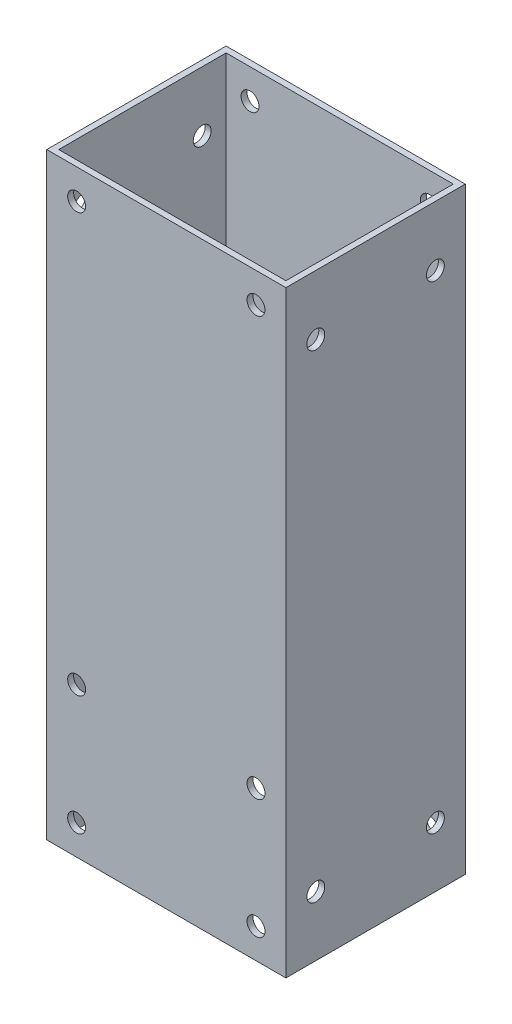
ISO-10303-21;
HEADER;
FILE_DESCRIPTION(('STEP AP214'),'2;1');
FILE_NAME('part.step','',(''),(''),'','','');
FILE_SCHEMA(('AUTOMOTIVE_DESIGN { 1 0 10303 214 1 1 1 1 }'));
ENDSEC;
DATA;
#1=APPLICATION_CONTEXT('core data for automotive mechanical design processes');
#2=APPLICATION_PROTOCOL_DEFINITION('international standard','automotive_design',2000,#1);
#3=PRODUCT_CONTEXT('',#1,'mechanical');
#4=PRODUCT('Part','Part','',(#3));
#5=PRODUCT_RELATED_PRODUCT_CATEGORY('part','',(#4));
#6=PRODUCT_DEFINITION_FORMATION('','',#4);
#7=PRODUCT_DEFINITION_CONTEXT('part definition',#1,'design');
#8=PRODUCT_DEFINITION('design','',#6,#7);
#9=PRODUCT_DEFINITION_SHAPE('','',#8);
#10=(LENGTH_UNIT() NAMED_UNIT(*) SI_UNIT(.MILLI.,.METRE.));
#11=(NAMED_UNIT(*) PLANE_ANGLE_UNIT() SI_UNIT($,.RADIAN.));
#12=(NAMED_UNIT(*) SI_UNIT($,.STERADIAN.) SOLID_ANGLE_UNIT());
#13=UNCERTAINTY_MEASURE_WITH_UNIT(LENGTH_MEASURE(1.E-05),#10,'distance_accuracy_value','');
#14=(GEOMETRIC_REPRESENTATION_CONTEXT(3) GLOBAL_UNCERTAINTY_ASSIGNED_CONTEXT((#13)) GLOBAL_UNIT_ASSIGNED_CONTEXT((#10,
#11,#12)) REPRESENTATION_CONTEXT('',''));
#15=CARTESIAN_POINT('',(0.,0.,0.));
#16=DIRECTION('',(0.,0.,1.));
#17=DIRECTION('',(1.,0.,0.));
#18=AXIS2_PLACEMENT_3D('',#15,#16,#17);
#19=CARTESIAN_POINT('',(0.,100.,0.));
#20=DIRECTION('',(0.,1.,0.));
#21=DIRECTION('',(0.,0.,1.));
#22=AXIS2_PLACEMENT_3D('',#19,#20,#21);
#23=PLANE('',#22);
#24=DIRECTION('',(0.,0.,1.));
#25=VECTOR('',#24,1.);
#26=CARTESIAN_POINT('',(0.,100.,0.));
#27=LINE('',#26,#25);
#28=CARTESIAN_POINT('',(0.,100.,-30.));
#29=VERTEX_POINT('',#28);
#30=CARTESIAN_POINT('',(0.,100.,0.));
#31=VERTEX_POINT('',#30);
#32=EDGE_CURVE('E165',#29,#31,#27,.T.);
#33=ORIENTED_EDGE('',*,*,#32,.T.);
#34=DIRECTION('',(1.,0.,0.));
#35=VECTOR('',#34,1.);
#36=CARTESIAN_POINT('',(0.,100.,0.));
#37=LINE('',#36,#35);
#38=CARTESIAN_POINT('',(40.,100.,0.));
#39=VERTEX_POINT('',#38);
#40=EDGE_CURVE('E168',#31,#39,#37,.T.);
#41=ORIENTED_EDGE('',*,*,#40,.T.);
#42=DIRECTION('',(0.,0.,-1.));
#43=VECTOR('',#42,1.);
#44=CARTESIAN_POINT('',(40.,100.,0.));
#45=LINE('',#44,#43);
#46=CARTESIAN_POINT('',(40.,100.,-30.));
#47=VERTEX_POINT('',#46);
#48=EDGE_CURVE('E171',#39,#47,#45,.T.);
#49=ORIENTED_EDGE('',*,*,#48,.T.);
#50=DIRECTION('',(-1.,0.,0.));
#51=VECTOR('',#50,1.);
#52=CARTESIAN_POINT('',(0.,100.,-30.));
#53=LINE('',#52,#51);
#54=EDGE_CURVE('E173',#47,#29,#53,.T.);
#55=ORIENTED_EDGE('',*,*,#54,.T.);
#56=EDGE_LOOP('',(#33,#41,#49,#55));
#57=FACE_BOUND('',#56,.T.);
#58=DIRECTION('',(1.,0.,0.));
#59=VECTOR('',#58,1.);
#60=CARTESIAN_POINT('',(0.,100.,-1.));
#61=LINE('',#60,#59);
#62=CARTESIAN_POINT('',(1.,100.,-1.));
#63=VERTEX_POINT('',#62);
#64=CARTESIAN_POINT('',(39.,100.,-1.));
#65=VERTEX_POINT('',#64);
#66=EDGE_CURVE('E135',#63,#65,#61,.T.);
#67=ORIENTED_EDGE('',*,*,#66,.F.);
#68=DIRECTION('',(0.,0.,1.));
#69=VECTOR('',#68,1.);
#70=CARTESIAN_POINT('',(1.,100.,0.));
#71=LINE('',#70,#69);
#72=CARTESIAN_POINT('',(1.,100.,-29.));
#73=VERTEX_POINT('',#72);
#74=EDGE_CURVE('E127',#73,#63,#71,.T.);
#75=ORIENTED_EDGE('',*,*,#74,.F.);
#76=DIRECTION('',(-1.,0.,0.));
#77=VECTOR('',#76,1.);
#78=CARTESIAN_POINT('',(0.,100.,-29.));
#79=LINE('',#78,#77);
#80=CARTESIAN_POINT('',(39.,100.,-29.));
#81=VERTEX_POINT('',#80);
#82=EDGE_CURVE('E149',#81,#73,#79,.T.);
#83=ORIENTED_EDGE('',*,*,#82,.F.);
#84=DIRECTION('',(0.,0.,-1.));
#85=VECTOR('',#84,1.);
#86=CARTESIAN_POINT('',(39.,100.,0.));
#87=LINE('',#86,#85);
#88=EDGE_CURVE('E147',#65,#81,#87,.T.);
#89=ORIENTED_EDGE('',*,*,#88,.F.);
#90=EDGE_LOOP('',(#67,#75,#83,#89));
#91=FACE_BOUND('',#90,.T.);
#92=ADVANCED_FACE('F60',(#57,#91),#23,.T.);
#93=CARTESIAN_POINT('',(0.,0.,0.));
#94=DIRECTION('',(0.,1.,0.));
#95=DIRECTION('',(0.,0.,1.));
#96=AXIS2_PLACEMENT_3D('',#93,#94,#95);
#97=PLANE('',#96);
#98=DIRECTION('',(0.,0.,1.));
#99=VECTOR('',#98,1.);
#100=CARTESIAN_POINT('',(0.,0.,0.));
#101=LINE('',#100,#99);
#102=CARTESIAN_POINT('',(0.,0.,-30.));
#103=VERTEX_POINT('',#102);
#104=CARTESIAN_POINT('',(0.,0.,0.));
#105=VERTEX_POINT('',#104);
#106=EDGE_CURVE('E143',#103,#105,#101,.T.);
#107=ORIENTED_EDGE('',*,*,#106,.F.);
#108=DIRECTION('',(-1.,0.,0.));
#109=VECTOR('',#108,1.);
#110=CARTESIAN_POINT('',(0.,0.,-30.));
#111=LINE('',#110,#109);
#112=CARTESIAN_POINT('',(40.,0.,-30.));
#113=VERTEX_POINT('',#112);
#114=EDGE_CURVE('E169',#113,#103,#111,.T.);
#115=ORIENTED_EDGE('',*,*,#114,.F.);
#116=DIRECTION('',(0.,0.,-1.));
#117=VECTOR('',#116,1.);
#118=CARTESIAN_POINT('',(40.,0.,0.));
#119=LINE('',#118,#117);
#120=CARTESIAN_POINT('',(40.,0.,0.));
#121=VERTEX_POINT('',#120);
#122=EDGE_CURVE('E180',#121,#113,#119,.T.);
#123=ORIENTED_EDGE('',*,*,#122,.F.);
#124=DIRECTION('',(1.,0.,0.));
#125=VECTOR('',#124,1.);
#126=CARTESIAN_POINT('',(0.,0.,0.));
#127=LINE('',#126,#125);
#128=EDGE_CURVE('E178',#105,#121,#127,.T.);
#129=ORIENTED_EDGE('',*,*,#128,.F.);
#130=EDGE_LOOP('',(#107,#115,#123,#129));
#131=FACE_BOUND('',#130,.T.);
#132=DIRECTION('',(0.,0.,1.));
#133=VECTOR('',#132,1.);
#134=CARTESIAN_POINT('',(1.,0.,0.));
#135=LINE('',#134,#133);
#136=CARTESIAN_POINT('',(1.,0.,-29.));
#137=VERTEX_POINT('',#136);
#138=CARTESIAN_POINT('',(1.,0.,-1.));
#139=VERTEX_POINT('',#138);
#140=EDGE_CURVE('E85',#137,#139,#135,.T.);
#141=ORIENTED_EDGE('',*,*,#140,.T.);
#142=DIRECTION('',(1.,0.,0.));
#143=VECTOR('',#142,1.);
#144=CARTESIAN_POINT('',(0.,0.,-1.));
#145=LINE('',#144,#143);
#146=CARTESIAN_POINT('',(39.,0.,-1.));
#147=VERTEX_POINT('',#146);
#148=EDGE_CURVE('E142',#139,#147,#145,.T.);
#149=ORIENTED_EDGE('',*,*,#148,.T.);
#150=DIRECTION('',(0.,0.,-1.));
#151=VECTOR('',#150,1.);
#152=CARTESIAN_POINT('',(39.,0.,0.));
#153=LINE('',#152,#151);
#154=CARTESIAN_POINT('',(39.,0.,-29.));
#155=VERTEX_POINT('',#154);
#156=EDGE_CURVE('E157',#147,#155,#153,.T.);
#157=ORIENTED_EDGE('',*,*,#156,.T.);
#158=DIRECTION('',(-1.,0.,0.));
#159=VECTOR('',#158,1.);
#160=CARTESIAN_POINT('',(0.,0.,-29.));
#161=LINE('',#160,#159);
#162=EDGE_CURVE('E136',#155,#137,#161,.T.);
#163=ORIENTED_EDGE('',*,*,#162,.T.);
#164=EDGE_LOOP('',(#141,#149,#157,#163));
#165=FACE_BOUND('',#164,.T.);
#166=ADVANCED_FACE('F326',(#131,#165),#97,.F.);
#167=CARTESIAN_POINT('',(0.,100.,0.));
#168=DIRECTION('',(1.,0.,0.));
#169=DIRECTION('',(0.,0.,-1.));
#170=AXIS2_PLACEMENT_3D('',#167,#168,#169);
#171=PLANE('',#170);
#172=CARTESIAN_POINT('',(0.,90.,-5.));
#173=DIRECTION('',(-1.,0.,0.));
#174=DIRECTION('',(0.,0.,1.));
#175=AXIS2_PLACEMENT_3D('',#172,#173,#174);
#176=CIRCLE('',#175,1.5);
#177=CARTESIAN_POINT('',(0.,90.,-3.5));
#178=VERTEX_POINT('',#177);
#179=EDGE_CURVE('E373',#178,#178,#176,.T.);
#180=ORIENTED_EDGE('',*,*,#179,.F.);
#181=EDGE_LOOP('',(#180));
#182=FACE_BOUND('',#181,.T.);
#183=CARTESIAN_POINT('',(0.,10.,-25.));
#184=DIRECTION('',(-1.,0.,0.));
#185=DIRECTION('',(0.,0.,1.));
#186=AXIS2_PLACEMENT_3D('',#183,#184,#185);
#187=CIRCLE('',#186,1.5);
#188=CARTESIAN_POINT('',(0.,10.,-23.5));
#189=VERTEX_POINT('',#188);
#190=EDGE_CURVE('E369',#189,#189,#187,.T.);
#191=ORIENTED_EDGE('',*,*,#190,.F.);
#192=EDGE_LOOP('',(#191));
#193=FACE_BOUND('',#192,.T.);
#194=CARTESIAN_POINT('',(0.,10.,-4.99999999999999));
#195=DIRECTION('',(-1.,0.,0.));
#196=DIRECTION('',(0.,0.,1.));
#197=AXIS2_PLACEMENT_3D('',#194,#195,#196);
#198=CIRCLE('',#197,1.5);
#199=CARTESIAN_POINT('',(0.,10.,-3.49999999999999));
#200=VERTEX_POINT('',#199);
#201=EDGE_CURVE('E377',#200,#200,#198,.T.);
#202=ORIENTED_EDGE('',*,*,#201,.F.);
#203=EDGE_LOOP('',(#202));
#204=FACE_BOUND('',#203,.T.);
#205=CARTESIAN_POINT('',(0.,90.,-25.));
#206=DIRECTION('',(-1.,0.,0.));
#207=DIRECTION('',(0.,0.,1.));
#208=AXIS2_PLACEMENT_3D('',#205,#206,#207);
#209=CIRCLE('',#208,1.5);
#210=CARTESIAN_POINT('',(0.,90.,-23.5));
#211=VERTEX_POINT('',#210);
#212=EDGE_CURVE('E365',#211,#211,#209,.T.);
#213=ORIENTED_EDGE('',*,*,#212,.F.);
#214=EDGE_LOOP('',(#213));
#215=FACE_BOUND('',#214,.T.);
#216=ORIENTED_EDGE('',*,*,#106,.T.);
#217=DIRECTION('',(0.,-1.,0.));
#218=VECTOR('',#217,1.);
#219=CARTESIAN_POINT('',(0.,100.,0.));
#220=LINE('',#219,#218);
#221=EDGE_CURVE('E12',#31,#105,#220,.T.);
#222=ORIENTED_EDGE('',*,*,#221,.F.);
#223=ORIENTED_EDGE('',*,*,#32,.F.);
#224=DIRECTION('',(0.,-1.,0.));
#225=VECTOR('',#224,1.);
#226=CARTESIAN_POINT('',(0.,100.,-30.));
#227=LINE('',#226,#225);
#228=EDGE_CURVE('E175',#29,#103,#227,.T.);
#229=ORIENTED_EDGE('',*,*,#228,.T.);
#230=EDGE_LOOP('',(#216,#222,#223,#229));
#231=FACE_BOUND('',#230,.T.);
#232=ADVANCED_FACE('F62',(#182,#193,#204,#215,#231),#171,.F.);
#233=CARTESIAN_POINT('',(0.,100.,0.));
#234=DIRECTION('',(0.,0.,-1.));
#235=DIRECTION('',(-1.,0.,0.));
#236=AXIS2_PLACEMENT_3D('',#233,#234,#235);
#237=PLANE('',#236);
#238=CARTESIAN_POINT('',(35.,95.,0.));
#239=DIRECTION('',(0.,0.,1.));
#240=DIRECTION('',(1.,0.,0.));
#241=AXIS2_PLACEMENT_3D('',#238,#239,#240);
#242=CIRCLE('',#241,1.5);
#243=CARTESIAN_POINT('',(36.5,95.,0.));
#244=VERTEX_POINT('',#243);
#245=EDGE_CURVE('E250',#244,#244,#242,.T.);
#246=ORIENTED_EDGE('',*,*,#245,.F.);
#247=EDGE_LOOP('',(#246));
#248=FACE_BOUND('',#247,.T.);
#249=CARTESIAN_POINT('',(35.,25.,0.));
#250=DIRECTION('',(0.,0.,1.));
#251=DIRECTION('',(1.,0.,0.));
#252=AXIS2_PLACEMENT_3D('',#249,#250,#251);
#253=CIRCLE('',#252,1.5);
#254=CARTESIAN_POINT('',(36.5,25.,0.));
#255=VERTEX_POINT('',#254);
#256=EDGE_CURVE('E256',#255,#255,#253,.T.);
#257=ORIENTED_EDGE('',*,*,#256,.F.);
#258=EDGE_LOOP('',(#257));
#259=FACE_BOUND('',#258,.T.);
#260=CARTESIAN_POINT('',(5.00000000000001,25.,0.));
#261=DIRECTION('',(0.,0.,1.));
#262=DIRECTION('',(1.,0.,0.));
#263=AXIS2_PLACEMENT_3D('',#260,#261,#262);
#264=CIRCLE('',#263,1.5);
#265=CARTESIAN_POINT('',(6.50000000000001,25.,0.));
#266=VERTEX_POINT('',#265);
#267=EDGE_CURVE('E262',#266,#266,#264,.T.);
#268=ORIENTED_EDGE('',*,*,#267,.F.);
#269=EDGE_LOOP('',(#268));
#270=FACE_BOUND('',#269,.T.);
#271=CARTESIAN_POINT('',(5.00000000000001,5.,0.));
#272=DIRECTION('',(0.,0.,1.));
#273=DIRECTION('',(1.,0.,0.));
#274=AXIS2_PLACEMENT_3D('',#271,#272,#273);
#275=CIRCLE('',#274,1.5);
#276=CARTESIAN_POINT('',(6.50000000000001,5.,0.));
#277=VERTEX_POINT('',#276);
#278=EDGE_CURVE('E243',#277,#277,#275,.T.);
#279=ORIENTED_EDGE('',*,*,#278,.F.);
#280=EDGE_LOOP('',(#279));
#281=FACE_BOUND('',#280,.T.);
#282=CARTESIAN_POINT('',(35.,5.,0.));
#283=DIRECTION('',(0.,0.,1.));
#284=DIRECTION('',(1.,0.,0.));
#285=AXIS2_PLACEMENT_3D('',#282,#283,#284);
#286=CIRCLE('',#285,1.5);
#287=CARTESIAN_POINT('',(36.5,5.,0.));
#288=VERTEX_POINT('',#287);
#289=EDGE_CURVE('E239',#288,#288,#286,.T.);
#290=ORIENTED_EDGE('',*,*,#289,.F.);
#291=EDGE_LOOP('',(#290));
#292=FACE_BOUND('',#291,.T.);
#293=CARTESIAN_POINT('',(5.,95.,0.));
#294=DIRECTION('',(0.,0.,1.));
#295=DIRECTION('',(1.,0.,0.));
#296=AXIS2_PLACEMENT_3D('',#293,#294,#295);
#297=CIRCLE('',#296,1.5);
#298=CARTESIAN_POINT('',(6.5,95.,0.));
#299=VERTEX_POINT('',#298);
#300=EDGE_CURVE('E249',#299,#299,#297,.T.);
#301=ORIENTED_EDGE('',*,*,#300,.F.);
#302=EDGE_LOOP('',(#301));
#303=FACE_BOUND('',#302,.T.);
#304=ORIENTED_EDGE('',*,*,#128,.T.);
#305=DIRECTION('',(0.,-1.,0.));
#306=VECTOR('',#305,1.);
#307=CARTESIAN_POINT('',(40.,100.,0.));
#308=LINE('',#307,#306);
#309=EDGE_CURVE('E69',#39,#121,#308,.T.);
#310=ORIENTED_EDGE('',*,*,#309,.F.);
#311=ORIENTED_EDGE('',*,*,#40,.F.);
#312=ORIENTED_EDGE('',*,*,#221,.T.);
#313=EDGE_LOOP('',(#304,#310,#311,#312));
#314=FACE_BOUND('',#313,.T.);
#315=ADVANCED_FACE('F312',(#248,#259,#270,#281,#292,#303,#314),#237,.F.);
#316=CARTESIAN_POINT('',(40.,100.,0.));
#317=DIRECTION('',(-1.,0.,0.));
#318=DIRECTION('',(0.,0.,1.));
#319=AXIS2_PLACEMENT_3D('',#316,#317,#318);
#320=PLANE('',#319);
#321=CARTESIAN_POINT('',(40.,90.,-5.));
#322=DIRECTION('',(-1.,0.,0.));
#323=DIRECTION('',(0.,0.,1.));
#324=AXIS2_PLACEMENT_3D('',#321,#322,#323);
#325=CIRCLE('',#324,1.5);
#326=CARTESIAN_POINT('',(40.,90.,-3.5));
#327=VERTEX_POINT('',#326);
#328=EDGE_CURVE('E353',#327,#327,#325,.T.);
#329=ORIENTED_EDGE('',*,*,#328,.T.);
#330=EDGE_LOOP('',(#329));
#331=FACE_BOUND('',#330,.T.);
#332=CARTESIAN_POINT('',(40.,10.,-25.));
#333=DIRECTION('',(-1.,0.,0.));
#334=DIRECTION('',(0.,0.,1.));
#335=AXIS2_PLACEMENT_3D('',#332,#333,#334);
#336=CIRCLE('',#335,1.5);
#337=CARTESIAN_POINT('',(40.,10.,-23.5));
#338=VERTEX_POINT('',#337);
#339=EDGE_CURVE('E357',#338,#338,#336,.T.);
#340=ORIENTED_EDGE('',*,*,#339,.T.);
#341=EDGE_LOOP('',(#340));
#342=FACE_BOUND('',#341,.T.);
#343=CARTESIAN_POINT('',(40.,10.,-4.99999999999999));
#344=DIRECTION('',(-1.,0.,0.));
#345=DIRECTION('',(0.,0.,1.));
#346=AXIS2_PLACEMENT_3D('',#343,#344,#345);
#347=CIRCLE('',#346,1.5);
#348=CARTESIAN_POINT('',(40.,10.,-3.49999999999999));
#349=VERTEX_POINT('',#348);
#350=EDGE_CURVE('E361',#349,#349,#347,.T.);
#351=ORIENTED_EDGE('',*,*,#350,.T.);
#352=EDGE_LOOP('',(#351));
#353=FACE_BOUND('',#352,.T.);
#354=CARTESIAN_POINT('',(40.,90.,-25.));
#355=DIRECTION('',(-1.,0.,0.));
#356=DIRECTION('',(0.,0.,1.));
#357=AXIS2_PLACEMENT_3D('',#354,#355,#356);
#358=CIRCLE('',#357,1.5);
#359=CARTESIAN_POINT('',(40.,90.,-23.5));
#360=VERTEX_POINT('',#359);
#361=EDGE_CURVE('E218',#360,#360,#358,.T.);
#362=ORIENTED_EDGE('',*,*,#361,.T.);
#363=EDGE_LOOP('',(#362));
#364=FACE_BOUND('',#363,.T.);
#365=ORIENTED_EDGE('',*,*,#122,.T.);
#366=DIRECTION('',(0.,-1.,0.));
#367=VECTOR('',#366,1.);
#368=CARTESIAN_POINT('',(40.,100.,-30.));
#369=LINE('',#368,#367);
#370=EDGE_CURVE('E185',#47,#113,#369,.T.);
#371=ORIENTED_EDGE('',*,*,#370,.F.);
#372=ORIENTED_EDGE('',*,*,#48,.F.);
#373=ORIENTED_EDGE('',*,*,#309,.T.);
#374=EDGE_LOOP('',(#365,#371,#372,#373));
#375=FACE_BOUND('',#374,.T.);
#376=ADVANCED_FACE('F315',(#331,#342,#353,#364,#375),#320,.F.);
#377=CARTESIAN_POINT('',(0.,100.,-30.));
#378=DIRECTION('',(0.,0.,1.));
#379=DIRECTION('',(1.,0.,0.));
#380=AXIS2_PLACEMENT_3D('',#377,#378,#379);
#381=PLANE('',#380);
#382=CARTESIAN_POINT('',(35.,95.,-30.));
#383=DIRECTION('',(0.,0.,1.));
#384=DIRECTION('',(1.,0.,0.));
#385=AXIS2_PLACEMENT_3D('',#382,#383,#384);
#386=CIRCLE('',#385,1.5);
#387=CARTESIAN_POINT('',(36.5,95.,-30.));
#388=VERTEX_POINT('',#387);
#389=EDGE_CURVE('E246',#388,#388,#386,.T.);
#390=ORIENTED_EDGE('',*,*,#389,.T.);
#391=EDGE_LOOP('',(#390));
#392=FACE_BOUND('',#391,.T.);
#393=CARTESIAN_POINT('',(35.,25.,-30.));
#394=DIRECTION('',(0.,0.,1.));
#395=DIRECTION('',(1.,0.,0.));
#396=AXIS2_PLACEMENT_3D('',#393,#394,#395);
#397=CIRCLE('',#396,1.5);
#398=CARTESIAN_POINT('',(36.5,25.,-30.));
#399=VERTEX_POINT('',#398);
#400=EDGE_CURVE('E253',#399,#399,#397,.T.);
#401=ORIENTED_EDGE('',*,*,#400,.T.);
#402=EDGE_LOOP('',(#401));
#403=FACE_BOUND('',#402,.T.);
#404=CARTESIAN_POINT('',(5.00000000000001,25.,-30.));
#405=DIRECTION('',(0.,0.,1.));
#406=DIRECTION('',(1.,0.,0.));
#407=AXIS2_PLACEMENT_3D('',#404,#405,#406);
#408=CIRCLE('',#407,1.5);
#409=CARTESIAN_POINT('',(6.50000000000001,25.,-30.));
#410=VERTEX_POINT('',#409);
#411=EDGE_CURVE('E259',#410,#410,#408,.T.);
#412=ORIENTED_EDGE('',*,*,#411,.T.);
#413=EDGE_LOOP('',(#412));
#414=FACE_BOUND('',#413,.T.);
#415=CARTESIAN_POINT('',(5.00000000000001,5.,-30.));
#416=DIRECTION('',(0.,0.,1.));
#417=DIRECTION('',(1.,0.,0.));
#418=AXIS2_PLACEMENT_3D('',#415,#416,#417);
#419=CIRCLE('',#418,1.5);
#420=CARTESIAN_POINT('',(6.50000000000001,5.,-30.));
#421=VERTEX_POINT('',#420);
#422=EDGE_CURVE('E265',#421,#421,#419,.T.);
#423=ORIENTED_EDGE('',*,*,#422,.T.);
#424=EDGE_LOOP('',(#423));
#425=FACE_BOUND('',#424,.T.);
#426=CARTESIAN_POINT('',(35.,5.,-30.));
#427=DIRECTION('',(0.,0.,1.));
#428=DIRECTION('',(1.,0.,0.));
#429=AXIS2_PLACEMENT_3D('',#426,#427,#428);
#430=CIRCLE('',#429,1.5);
#431=CARTESIAN_POINT('',(36.5,5.,-30.));
#432=VERTEX_POINT('',#431);
#433=EDGE_CURVE('E240',#432,#432,#430,.T.);
#434=ORIENTED_EDGE('',*,*,#433,.T.);
#435=EDGE_LOOP('',(#434));
#436=FACE_BOUND('',#435,.T.);
#437=CARTESIAN_POINT('',(5.,95.,-30.));
#438=DIRECTION('',(0.,0.,1.));
#439=DIRECTION('',(1.,0.,0.));
#440=AXIS2_PLACEMENT_3D('',#437,#438,#439);
#441=CIRCLE('',#440,1.5);
#442=CARTESIAN_POINT('',(6.5,95.,-30.));
#443=VERTEX_POINT('',#442);
#444=EDGE_CURVE('E194',#443,#443,#441,.T.);
#445=ORIENTED_EDGE('',*,*,#444,.T.);
#446=EDGE_LOOP('',(#445));
#447=FACE_BOUND('',#446,.T.);
#448=ORIENTED_EDGE('',*,*,#114,.T.);
#449=ORIENTED_EDGE('',*,*,#228,.F.);
#450=ORIENTED_EDGE('',*,*,#54,.F.);
#451=ORIENTED_EDGE('',*,*,#370,.T.);
#452=EDGE_LOOP('',(#448,#449,#450,#451));
#453=FACE_BOUND('',#452,.T.);
#454=ADVANCED_FACE('F330',(#392,#403,#414,#425,#436,#447,#453),#381,.F.);
#455=CARTESIAN_POINT('',(1.,100.,0.));
#456=DIRECTION('',(1.,0.,0.));
#457=DIRECTION('',(0.,0.,-1.));
#458=AXIS2_PLACEMENT_3D('',#455,#456,#457);
#459=PLANE('',#458);
#460=CARTESIAN_POINT('',(1.,90.,-5.));
#461=DIRECTION('',(1.,0.,0.));
#462=DIRECTION('',(0.,0.,-1.));
#463=AXIS2_PLACEMENT_3D('',#460,#461,#462);
#464=CIRCLE('',#463,1.5);
#465=CARTESIAN_POINT('',(1.,90.,-6.5));
#466=VERTEX_POINT('',#465);
#467=EDGE_CURVE('E236',#466,#466,#464,.T.);
#468=ORIENTED_EDGE('',*,*,#467,.F.);
#469=EDGE_LOOP('',(#468));
#470=FACE_BOUND('',#469,.T.);
#471=CARTESIAN_POINT('',(1.,10.,-25.));
#472=DIRECTION('',(1.,0.,0.));
#473=DIRECTION('',(0.,0.,-1.));
#474=AXIS2_PLACEMENT_3D('',#471,#472,#473);
#475=CIRCLE('',#474,1.5);
#476=CARTESIAN_POINT('',(1.,10.,-26.5));
#477=VERTEX_POINT('',#476);
#478=EDGE_CURVE('E224',#477,#477,#475,.T.);
#479=ORIENTED_EDGE('',*,*,#478,.F.);
#480=EDGE_LOOP('',(#479));
#481=FACE_BOUND('',#480,.T.);
#482=CARTESIAN_POINT('',(1.,10.,-4.99999999999999));
#483=DIRECTION('',(1.,0.,0.));
#484=DIRECTION('',(0.,0.,-1.));
#485=AXIS2_PLACEMENT_3D('',#482,#483,#484);
#486=CIRCLE('',#485,1.5);
#487=CARTESIAN_POINT('',(1.,10.,-6.49999999999999));
#488=VERTEX_POINT('',#487);
#489=EDGE_CURVE('E221',#488,#488,#486,.T.);
#490=ORIENTED_EDGE('',*,*,#489,.F.);
#491=EDGE_LOOP('',(#490));
#492=FACE_BOUND('',#491,.T.);
#493=CARTESIAN_POINT('',(1.,90.,-25.));
#494=DIRECTION('',(1.,0.,0.));
#495=DIRECTION('',(0.,0.,-1.));
#496=AXIS2_PLACEMENT_3D('',#493,#494,#495);
#497=CIRCLE('',#496,1.5);
#498=CARTESIAN_POINT('',(1.,90.,-26.5));
#499=VERTEX_POINT('',#498);
#500=EDGE_CURVE('E217',#499,#499,#497,.T.);
#501=ORIENTED_EDGE('',*,*,#500,.F.);
#502=EDGE_LOOP('',(#501));
#503=FACE_BOUND('',#502,.T.);
#504=ORIENTED_EDGE('',*,*,#140,.F.);
#505=DIRECTION('',(0.,-1.,0.));
#506=VECTOR('',#505,1.);
#507=CARTESIAN_POINT('',(1.,100.,-29.));
#508=LINE('',#507,#506);
#509=EDGE_CURVE('E131',#73,#137,#508,.T.);
#510=ORIENTED_EDGE('',*,*,#509,.F.);
#511=ORIENTED_EDGE('',*,*,#74,.T.);
#512=DIRECTION('',(0.,-1.,0.));
#513=VECTOR('',#512,1.);
#514=CARTESIAN_POINT('',(1.,100.,-1.));
#515=LINE('',#514,#513);
#516=EDGE_CURVE('E130',#63,#139,#515,.T.);
#517=ORIENTED_EDGE('',*,*,#516,.T.);
#518=EDGE_LOOP('',(#504,#510,#511,#517));
#519=FACE_BOUND('',#518,.T.);
#520=ADVANCED_FACE('F129',(#470,#481,#492,#503,#519),#459,.T.);
#521=CARTESIAN_POINT('',(0.,100.,-1.));
#522=DIRECTION('',(0.,0.,-1.));
#523=DIRECTION('',(-1.,0.,0.));
#524=AXIS2_PLACEMENT_3D('',#521,#522,#523);
#525=PLANE('',#524);
#526=CARTESIAN_POINT('',(35.,95.,-1.));
#527=DIRECTION('',(0.,0.,-1.));
#528=DIRECTION('',(-1.,0.,0.));
#529=AXIS2_PLACEMENT_3D('',#526,#527,#528);
#530=CIRCLE('',#529,1.5);
#531=CARTESIAN_POINT('',(33.5,95.,-1.));
#532=VERTEX_POINT('',#531);
#533=EDGE_CURVE('E155',#532,#532,#530,.T.);
#534=ORIENTED_EDGE('',*,*,#533,.F.);
#535=EDGE_LOOP('',(#534));
#536=FACE_BOUND('',#535,.T.);
#537=CARTESIAN_POINT('',(35.,25.,-1.));
#538=DIRECTION('',(0.,0.,-1.));
#539=DIRECTION('',(-1.,0.,0.));
#540=AXIS2_PLACEMENT_3D('',#537,#538,#539);
#541=CIRCLE('',#540,1.5);
#542=CARTESIAN_POINT('',(33.5,25.,-1.));
#543=VERTEX_POINT('',#542);
#544=EDGE_CURVE('E210',#543,#543,#541,.T.);
#545=ORIENTED_EDGE('',*,*,#544,.F.);
#546=EDGE_LOOP('',(#545));
#547=FACE_BOUND('',#546,.T.);
#548=CARTESIAN_POINT('',(5.00000000000001,25.,-1.));
#549=DIRECTION('',(0.,0.,-1.));
#550=DIRECTION('',(-1.,0.,0.));
#551=AXIS2_PLACEMENT_3D('',#548,#549,#550);
#552=CIRCLE('',#551,1.5);
#553=CARTESIAN_POINT('',(3.50000000000001,25.,-1.));
#554=VERTEX_POINT('',#553);
#555=EDGE_CURVE('E206',#554,#554,#552,.T.);
#556=ORIENTED_EDGE('',*,*,#555,.F.);
#557=EDGE_LOOP('',(#556));
#558=FACE_BOUND('',#557,.T.);
#559=CARTESIAN_POINT('',(5.00000000000001,5.,-1.));
#560=DIRECTION('',(0.,0.,-1.));
#561=DIRECTION('',(-1.,0.,0.));
#562=AXIS2_PLACEMENT_3D('',#559,#560,#561);
#563=CIRCLE('',#562,1.5);
#564=CARTESIAN_POINT('',(3.50000000000001,5.,-1.));
#565=VERTEX_POINT('',#564);
#566=EDGE_CURVE('E202',#565,#565,#563,.T.);
#567=ORIENTED_EDGE('',*,*,#566,.F.);
#568=EDGE_LOOP('',(#567));
#569=FACE_BOUND('',#568,.T.);
#570=CARTESIAN_POINT('',(35.,5.,-1.));
#571=DIRECTION('',(0.,0.,-1.));
#572=DIRECTION('',(-1.,0.,0.));
#573=AXIS2_PLACEMENT_3D('',#570,#571,#572);
#574=CIRCLE('',#573,1.5);
#575=CARTESIAN_POINT('',(33.5,5.,-1.));
#576=VERTEX_POINT('',#575);
#577=EDGE_CURVE('E198',#576,#576,#574,.T.);
#578=ORIENTED_EDGE('',*,*,#577,.F.);
#579=EDGE_LOOP('',(#578));
#580=FACE_BOUND('',#579,.T.);
#581=CARTESIAN_POINT('',(5.,95.,-1.));
#582=DIRECTION('',(0.,0.,-1.));
#583=DIRECTION('',(-1.,0.,0.));
#584=AXIS2_PLACEMENT_3D('',#581,#582,#583);
#585=CIRCLE('',#584,1.5);
#586=CARTESIAN_POINT('',(3.5,95.,-1.));
#587=VERTEX_POINT('',#586);
#588=EDGE_CURVE('E193',#587,#587,#585,.T.);
#589=ORIENTED_EDGE('',*,*,#588,.F.);
#590=EDGE_LOOP('',(#589));
#591=FACE_BOUND('',#590,.T.);
#592=ORIENTED_EDGE('',*,*,#148,.F.);
#593=ORIENTED_EDGE('',*,*,#516,.F.);
#594=ORIENTED_EDGE('',*,*,#66,.T.);
#595=DIRECTION('',(0.,-1.,0.));
#596=VECTOR('',#595,1.);
#597=CARTESIAN_POINT('',(39.,100.,-1.));
#598=LINE('',#597,#596);
#599=EDGE_CURVE('E144',#65,#147,#598,.T.);
#600=ORIENTED_EDGE('',*,*,#599,.T.);
#601=EDGE_LOOP('',(#592,#593,#594,#600));
#602=FACE_BOUND('',#601,.T.);
#603=ADVANCED_FACE('F139',(#536,#547,#558,#569,#580,#591,#602),#525,.T.);
#604=CARTESIAN_POINT('',(39.,100.,0.));
#605=DIRECTION('',(-1.,0.,0.));
#606=DIRECTION('',(0.,0.,1.));
#607=AXIS2_PLACEMENT_3D('',#604,#605,#606);
#608=PLANE('',#607);
#609=CARTESIAN_POINT('',(39.,90.,-5.));
#610=DIRECTION('',(-1.,0.,0.));
#611=DIRECTION('',(0.,0.,1.));
#612=AXIS2_PLACEMENT_3D('',#609,#610,#611);
#613=CIRCLE('',#612,1.5);
#614=CARTESIAN_POINT('',(39.,90.,-3.5));
#615=VERTEX_POINT('',#614);
#616=EDGE_CURVE('E64',#615,#615,#613,.T.);
#617=ORIENTED_EDGE('',*,*,#616,.F.);
#618=EDGE_LOOP('',(#617));
#619=FACE_BOUND('',#618,.T.);
#620=CARTESIAN_POINT('',(39.,10.,-25.));
#621=DIRECTION('',(-1.,0.,0.));
#622=DIRECTION('',(0.,0.,1.));
#623=AXIS2_PLACEMENT_3D('',#620,#621,#622);
#624=CIRCLE('',#623,1.5);
#625=CARTESIAN_POINT('',(39.,10.,-23.5));
#626=VERTEX_POINT('',#625);
#627=EDGE_CURVE('E222',#626,#626,#624,.T.);
#628=ORIENTED_EDGE('',*,*,#627,.F.);
#629=EDGE_LOOP('',(#628));
#630=FACE_BOUND('',#629,.T.);
#631=CARTESIAN_POINT('',(39.,10.,-4.99999999999999));
#632=DIRECTION('',(-1.,0.,0.));
#633=DIRECTION('',(0.,0.,1.));
#634=AXIS2_PLACEMENT_3D('',#631,#632,#633);
#635=CIRCLE('',#634,1.5);
#636=CARTESIAN_POINT('',(39.,10.,-3.49999999999999));
#637=VERTEX_POINT('',#636);
#638=EDGE_CURVE('E219',#637,#637,#635,.T.);
#639=ORIENTED_EDGE('',*,*,#638,.F.);
#640=EDGE_LOOP('',(#639));
#641=FACE_BOUND('',#640,.T.);
#642=CARTESIAN_POINT('',(39.,90.,-25.));
#643=DIRECTION('',(-1.,0.,0.));
#644=DIRECTION('',(0.,0.,1.));
#645=AXIS2_PLACEMENT_3D('',#642,#643,#644);
#646=CIRCLE('',#645,1.5);
#647=CARTESIAN_POINT('',(39.,90.,-23.5));
#648=VERTEX_POINT('',#647);
#649=EDGE_CURVE('E214',#648,#648,#646,.T.);
#650=ORIENTED_EDGE('',*,*,#649,.F.);
#651=EDGE_LOOP('',(#650));
#652=FACE_BOUND('',#651,.T.);
#653=ORIENTED_EDGE('',*,*,#156,.F.);
#654=ORIENTED_EDGE('',*,*,#599,.F.);
#655=ORIENTED_EDGE('',*,*,#88,.T.);
#656=DIRECTION('',(0.,-1.,0.));
#657=VECTOR('',#656,1.);
#658=CARTESIAN_POINT('',(39.,100.,-29.));
#659=LINE('',#658,#657);
#660=EDGE_CURVE('E77',#81,#155,#659,.T.);
#661=ORIENTED_EDGE('',*,*,#660,.T.);
#662=EDGE_LOOP('',(#653,#654,#655,#661));
#663=FACE_BOUND('',#662,.T.);
#664=ADVANCED_FACE('F291',(#619,#630,#641,#652,#663),#608,.T.);
#665=CARTESIAN_POINT('',(0.,100.,-29.));
#666=DIRECTION('',(0.,0.,1.));
#667=DIRECTION('',(1.,0.,0.));
#668=AXIS2_PLACEMENT_3D('',#665,#666,#667);
#669=PLANE('',#668);
#670=CARTESIAN_POINT('',(35.,95.,-29.));
#671=DIRECTION('',(0.,0.,1.));
#672=DIRECTION('',(1.,0.,0.));
#673=AXIS2_PLACEMENT_3D('',#670,#671,#672);
#674=CIRCLE('',#673,1.5);
#675=CARTESIAN_POINT('',(36.5,95.,-29.));
#676=VERTEX_POINT('',#675);
#677=EDGE_CURVE('E211',#676,#676,#674,.T.);
#678=ORIENTED_EDGE('',*,*,#677,.F.);
#679=EDGE_LOOP('',(#678));
#680=FACE_BOUND('',#679,.T.);
#681=CARTESIAN_POINT('',(35.,25.,-29.));
#682=DIRECTION('',(0.,0.,1.));
#683=DIRECTION('',(1.,0.,0.));
#684=AXIS2_PLACEMENT_3D('',#681,#682,#683);
#685=CIRCLE('',#684,1.5);
#686=CARTESIAN_POINT('',(36.5,25.,-29.));
#687=VERTEX_POINT('',#686);
#688=EDGE_CURVE('E207',#687,#687,#685,.T.);
#689=ORIENTED_EDGE('',*,*,#688,.F.);
#690=EDGE_LOOP('',(#689));
#691=FACE_BOUND('',#690,.T.);
#692=CARTESIAN_POINT('',(5.00000000000001,25.,-29.));
#693=DIRECTION('',(0.,0.,1.));
#694=DIRECTION('',(1.,0.,0.));
#695=AXIS2_PLACEMENT_3D('',#692,#693,#694);
#696=CIRCLE('',#695,1.5);
#697=CARTESIAN_POINT('',(6.50000000000001,25.,-29.));
#698=VERTEX_POINT('',#697);
#699=EDGE_CURVE('E203',#698,#698,#696,.T.);
#700=ORIENTED_EDGE('',*,*,#699,.F.);
#701=EDGE_LOOP('',(#700));
#702=FACE_BOUND('',#701,.T.);
#703=CARTESIAN_POINT('',(5.00000000000001,5.,-29.));
#704=DIRECTION('',(0.,0.,1.));
#705=DIRECTION('',(1.,0.,0.));
#706=AXIS2_PLACEMENT_3D('',#703,#704,#705);
#707=CIRCLE('',#706,1.5);
#708=CARTESIAN_POINT('',(6.50000000000001,5.,-29.));
#709=VERTEX_POINT('',#708);
#710=EDGE_CURVE('E199',#709,#709,#707,.T.);
#711=ORIENTED_EDGE('',*,*,#710,.F.);
#712=EDGE_LOOP('',(#711));
#713=FACE_BOUND('',#712,.T.);
#714=CARTESIAN_POINT('',(35.,5.,-29.));
#715=DIRECTION('',(0.,0.,1.));
#716=DIRECTION('',(1.,0.,0.));
#717=AXIS2_PLACEMENT_3D('',#714,#715,#716);
#718=CIRCLE('',#717,1.5);
#719=CARTESIAN_POINT('',(36.5,5.,-29.));
#720=VERTEX_POINT('',#719);
#721=EDGE_CURVE('E195',#720,#720,#718,.T.);
#722=ORIENTED_EDGE('',*,*,#721,.F.);
#723=EDGE_LOOP('',(#722));
#724=FACE_BOUND('',#723,.T.);
#725=CARTESIAN_POINT('',(5.,95.,-29.));
#726=DIRECTION('',(0.,0.,1.));
#727=DIRECTION('',(1.,0.,0.));
#728=AXIS2_PLACEMENT_3D('',#725,#726,#727);
#729=CIRCLE('',#728,1.5);
#730=CARTESIAN_POINT('',(6.5,95.,-29.));
#731=VERTEX_POINT('',#730);
#732=EDGE_CURVE('E190',#731,#731,#729,.T.);
#733=ORIENTED_EDGE('',*,*,#732,.F.);
#734=EDGE_LOOP('',(#733));
#735=FACE_BOUND('',#734,.T.);
#736=ORIENTED_EDGE('',*,*,#162,.F.);
#737=ORIENTED_EDGE('',*,*,#660,.F.);
#738=ORIENTED_EDGE('',*,*,#82,.T.);
#739=ORIENTED_EDGE('',*,*,#509,.T.);
#740=EDGE_LOOP('',(#736,#737,#738,#739));
#741=FACE_BOUND('',#740,.T.);
#742=ADVANCED_FACE('F422',(#680,#691,#702,#713,#724,#735,#741),#669,.T.);
#743=CARTESIAN_POINT('',(5.,95.,-30.));
#744=DIRECTION('',(0.,0.,1.));
#745=DIRECTION('',(1.,0.,0.));
#746=AXIS2_PLACEMENT_3D('',#743,#744,#745);
#747=CYLINDRICAL_SURFACE('',#746,1.5);
#748=ORIENTED_EDGE('',*,*,#732,.T.);
#749=EDGE_LOOP('',(#748));
#750=FACE_BOUND('',#749,.T.);
#751=ORIENTED_EDGE('',*,*,#444,.F.);
#752=EDGE_LOOP('',(#751));
#753=FACE_BOUND('',#752,.T.);
#754=ADVANCED_FACE('F309',(#750,#753),#747,.F.);
#755=CARTESIAN_POINT('',(35.,5.,-30.));
#756=DIRECTION('',(0.,0.,1.));
#757=DIRECTION('',(1.,0.,0.));
#758=AXIS2_PLACEMENT_3D('',#755,#756,#757);
#759=CYLINDRICAL_SURFACE('',#758,1.5);
#760=ORIENTED_EDGE('',*,*,#721,.T.);
#761=EDGE_LOOP('',(#760));
#762=FACE_BOUND('',#761,.T.);
#763=ORIENTED_EDGE('',*,*,#433,.F.);
#764=EDGE_LOOP('',(#763));
#765=FACE_BOUND('',#764,.T.);
#766=ADVANCED_FACE('F432',(#762,#765),#759,.F.);
#767=CARTESIAN_POINT('',(5.00000000000001,5.,-30.));
#768=DIRECTION('',(0.,0.,1.));
#769=DIRECTION('',(1.,0.,0.));
#770=AXIS2_PLACEMENT_3D('',#767,#768,#769);
#771=CYLINDRICAL_SURFACE('',#770,1.5);
#772=ORIENTED_EDGE('',*,*,#710,.T.);
#773=EDGE_LOOP('',(#772));
#774=FACE_BOUND('',#773,.T.);
#775=ORIENTED_EDGE('',*,*,#422,.F.);
#776=EDGE_LOOP('',(#775));
#777=FACE_BOUND('',#776,.T.);
#778=ADVANCED_FACE('F437',(#774,#777),#771,.F.);
#779=CARTESIAN_POINT('',(5.00000000000001,25.,-30.));
#780=DIRECTION('',(0.,0.,1.));
#781=DIRECTION('',(1.,0.,0.));
#782=AXIS2_PLACEMENT_3D('',#779,#780,#781);
#783=CYLINDRICAL_SURFACE('',#782,1.5);
#784=ORIENTED_EDGE('',*,*,#699,.T.);
#785=EDGE_LOOP('',(#784));
#786=FACE_BOUND('',#785,.T.);
#787=ORIENTED_EDGE('',*,*,#411,.F.);
#788=EDGE_LOOP('',(#787));
#789=FACE_BOUND('',#788,.T.);
#790=ADVANCED_FACE('F440',(#786,#789),#783,.F.);
#791=CARTESIAN_POINT('',(35.,25.,-30.));
#792=DIRECTION('',(0.,0.,1.));
#793=DIRECTION('',(1.,0.,0.));
#794=AXIS2_PLACEMENT_3D('',#791,#792,#793);
#795=CYLINDRICAL_SURFACE('',#794,1.5);
#796=ORIENTED_EDGE('',*,*,#688,.T.);
#797=EDGE_LOOP('',(#796));
#798=FACE_BOUND('',#797,.T.);
#799=ORIENTED_EDGE('',*,*,#400,.F.);
#800=EDGE_LOOP('',(#799));
#801=FACE_BOUND('',#800,.T.);
#802=ADVANCED_FACE('F445',(#798,#801),#795,.F.);
#803=CARTESIAN_POINT('',(35.,95.,-30.));
#804=DIRECTION('',(0.,0.,1.));
#805=DIRECTION('',(1.,0.,0.));
#806=AXIS2_PLACEMENT_3D('',#803,#804,#805);
#807=CYLINDRICAL_SURFACE('',#806,1.5);
#808=ORIENTED_EDGE('',*,*,#677,.T.);
#809=EDGE_LOOP('',(#808));
#810=FACE_BOUND('',#809,.T.);
#811=ORIENTED_EDGE('',*,*,#389,.F.);
#812=EDGE_LOOP('',(#811));
#813=FACE_BOUND('',#812,.T.);
#814=ADVANCED_FACE('F307',(#810,#813),#807,.F.);
#815=ORIENTED_EDGE('',*,*,#588,.T.);
#816=EDGE_LOOP('',(#815));
#817=FACE_BOUND('',#816,.T.);
#818=ORIENTED_EDGE('',*,*,#300,.T.);
#819=EDGE_LOOP('',(#818));
#820=FACE_BOUND('',#819,.T.);
#821=ADVANCED_FACE('F303',(#817,#820),#747,.F.);
#822=ORIENTED_EDGE('',*,*,#577,.T.);
#823=EDGE_LOOP('',(#822));
#824=FACE_BOUND('',#823,.T.);
#825=ORIENTED_EDGE('',*,*,#289,.T.);
#826=EDGE_LOOP('',(#825));
#827=FACE_BOUND('',#826,.T.);
#828=ADVANCED_FACE('F306',(#824,#827),#759,.F.);
#829=ORIENTED_EDGE('',*,*,#566,.T.);
#830=EDGE_LOOP('',(#829));
#831=FACE_BOUND('',#830,.T.);
#832=ORIENTED_EDGE('',*,*,#278,.T.);
#833=EDGE_LOOP('',(#832));
#834=FACE_BOUND('',#833,.T.);
#835=ADVANCED_FACE('F442',(#831,#834),#771,.F.);
#836=ORIENTED_EDGE('',*,*,#555,.T.);
#837=EDGE_LOOP('',(#836));
#838=FACE_BOUND('',#837,.T.);
#839=ORIENTED_EDGE('',*,*,#267,.T.);
#840=EDGE_LOOP('',(#839));
#841=FACE_BOUND('',#840,.T.);
#842=ADVANCED_FACE('F447',(#838,#841),#783,.F.);
#843=ORIENTED_EDGE('',*,*,#544,.T.);
#844=EDGE_LOOP('',(#843));
#845=FACE_BOUND('',#844,.T.);
#846=ORIENTED_EDGE('',*,*,#256,.T.);
#847=EDGE_LOOP('',(#846));
#848=FACE_BOUND('',#847,.T.);
#849=ADVANCED_FACE('F416',(#845,#848),#795,.F.);
#850=ORIENTED_EDGE('',*,*,#533,.T.);
#851=EDGE_LOOP('',(#850));
#852=FACE_BOUND('',#851,.T.);
#853=ORIENTED_EDGE('',*,*,#245,.T.);
#854=EDGE_LOOP('',(#853));
#855=FACE_BOUND('',#854,.T.);
#856=ADVANCED_FACE('F286',(#852,#855),#807,.F.);
#857=CARTESIAN_POINT('',(40.,90.,-25.));
#858=DIRECTION('',(-1.,0.,0.));
#859=DIRECTION('',(0.,0.,1.));
#860=AXIS2_PLACEMENT_3D('',#857,#858,#859);
#861=CYLINDRICAL_SURFACE('',#860,1.5);
#862=ORIENTED_EDGE('',*,*,#649,.T.);
#863=EDGE_LOOP('',(#862));
#864=FACE_BOUND('',#863,.T.);
#865=ORIENTED_EDGE('',*,*,#361,.F.);
#866=EDGE_LOOP('',(#865));
#867=FACE_BOUND('',#866,.T.);
#868=ADVANCED_FACE('F394',(#864,#867),#861,.F.);
#869=CARTESIAN_POINT('',(40.,10.,-4.99999999999999));
#870=DIRECTION('',(-1.,0.,0.));
#871=DIRECTION('',(0.,0.,1.));
#872=AXIS2_PLACEMENT_3D('',#869,#870,#871);
#873=CYLINDRICAL_SURFACE('',#872,1.5);
#874=ORIENTED_EDGE('',*,*,#638,.T.);
#875=EDGE_LOOP('',(#874));
#876=FACE_BOUND('',#875,.T.);
#877=ORIENTED_EDGE('',*,*,#350,.F.);
#878=EDGE_LOOP('',(#877));
#879=FACE_BOUND('',#878,.T.);
#880=ADVANCED_FACE('F401',(#876,#879),#873,.F.);
#881=CARTESIAN_POINT('',(40.,10.,-25.));
#882=DIRECTION('',(-1.,0.,0.));
#883=DIRECTION('',(0.,0.,1.));
#884=AXIS2_PLACEMENT_3D('',#881,#882,#883);
#885=CYLINDRICAL_SURFACE('',#884,1.5);
#886=ORIENTED_EDGE('',*,*,#627,.T.);
#887=EDGE_LOOP('',(#886));
#888=FACE_BOUND('',#887,.T.);
#889=ORIENTED_EDGE('',*,*,#339,.F.);
#890=EDGE_LOOP('',(#889));
#891=FACE_BOUND('',#890,.T.);
#892=ADVANCED_FACE('F402',(#888,#891),#885,.F.);
#893=CARTESIAN_POINT('',(40.,90.,-5.));
#894=DIRECTION('',(-1.,0.,0.));
#895=DIRECTION('',(0.,0.,1.));
#896=AXIS2_PLACEMENT_3D('',#893,#894,#895);
#897=CYLINDRICAL_SURFACE('',#896,1.5);
#898=ORIENTED_EDGE('',*,*,#616,.T.);
#899=EDGE_LOOP('',(#898));
#900=FACE_BOUND('',#899,.T.);
#901=ORIENTED_EDGE('',*,*,#328,.F.);
#902=EDGE_LOOP('',(#901));
#903=FACE_BOUND('',#902,.T.);
#904=ADVANCED_FACE('F391',(#900,#903),#897,.F.);
#905=ORIENTED_EDGE('',*,*,#500,.T.);
#906=EDGE_LOOP('',(#905));
#907=FACE_BOUND('',#906,.T.);
#908=ORIENTED_EDGE('',*,*,#212,.T.);
#909=EDGE_LOOP('',(#908));
#910=FACE_BOUND('',#909,.T.);
#911=ADVANCED_FACE('F389',(#907,#910),#861,.F.);
#912=ORIENTED_EDGE('',*,*,#489,.T.);
#913=EDGE_LOOP('',(#912));
#914=FACE_BOUND('',#913,.T.);
#915=ORIENTED_EDGE('',*,*,#201,.T.);
#916=EDGE_LOOP('',(#915));
#917=FACE_BOUND('',#916,.T.);
#918=ADVANCED_FACE('F382',(#914,#917),#873,.F.);
#919=ORIENTED_EDGE('',*,*,#478,.T.);
#920=EDGE_LOOP('',(#919));
#921=FACE_BOUND('',#920,.T.);
#922=ORIENTED_EDGE('',*,*,#190,.T.);
#923=EDGE_LOOP('',(#922));
#924=FACE_BOUND('',#923,.T.);
#925=ADVANCED_FACE('F399',(#921,#924),#885,.F.);
#926=ORIENTED_EDGE('',*,*,#467,.T.);
#927=EDGE_LOOP('',(#926));
#928=FACE_BOUND('',#927,.T.);
#929=ORIENTED_EDGE('',*,*,#179,.T.);
#930=EDGE_LOOP('',(#929));
#931=FACE_BOUND('',#930,.T.);
#932=ADVANCED_FACE('F405',(#928,#931),#897,.F.);
#933=CLOSED_SHELL('',(#92,#166,#232,#315,#376,#454,#520,#603,#664,#742,#754,#766,#778,#790,#802,
#814,#821,#828,#835,#842,#849,#856,#868,#880,#892,#904,#911,#918,#925,#932));
#934=MANIFOLD_SOLID_BREP('B2',#933);
#935=ADVANCED_BREP_SHAPE_REPRESENTATION('',(#18,#934),#14);
#936=SHAPE_DEFINITION_REPRESENTATION(#9,#935);
ENDSEC;
END-ISO-10303-21;
